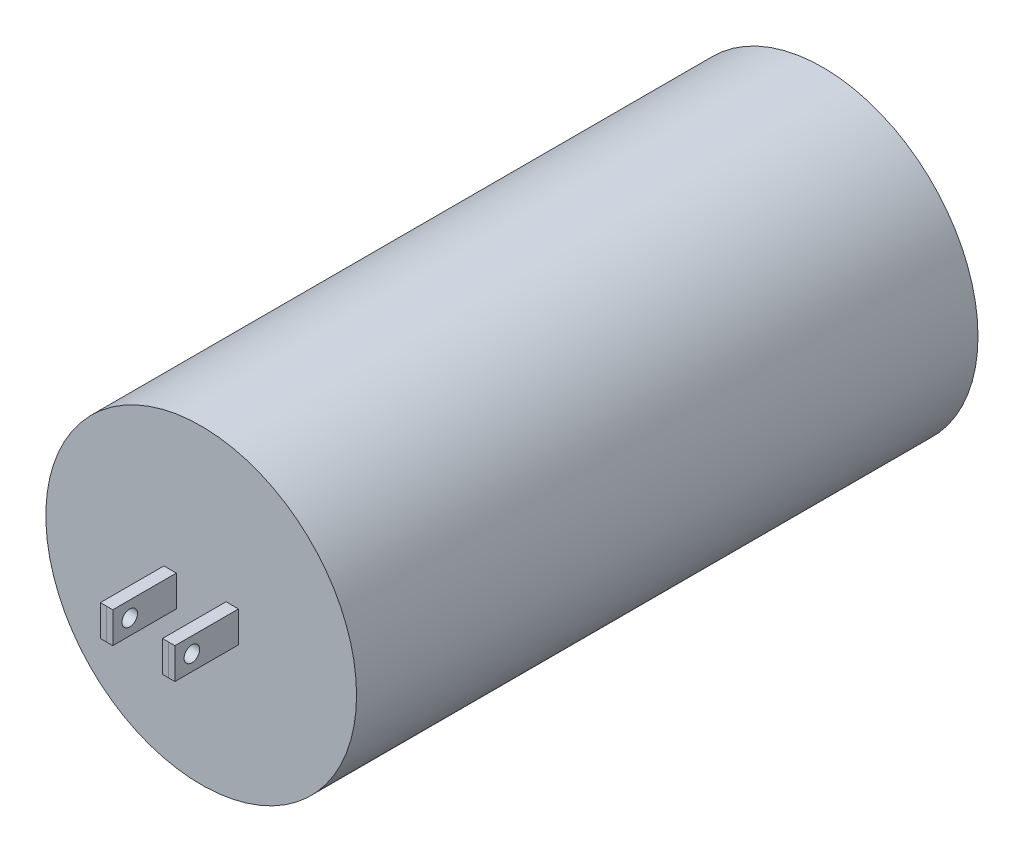
ISO-10303-21;
HEADER;
FILE_DESCRIPTION(('STEP AP214'),'2;1');
FILE_NAME('part.step','',(''),(''),'','','');
FILE_SCHEMA(('AUTOMOTIVE_DESIGN { 1 0 10303 214 1 1 1 1 }'));
ENDSEC;
DATA;
#1=APPLICATION_CONTEXT('core data for automotive mechanical design processes');
#2=APPLICATION_PROTOCOL_DEFINITION('international standard','automotive_design',2000,#1);
#3=PRODUCT_CONTEXT('',#1,'mechanical');
#4=PRODUCT('Part','Part','',(#3));
#5=PRODUCT_RELATED_PRODUCT_CATEGORY('part','',(#4));
#6=PRODUCT_DEFINITION_FORMATION('','',#4);
#7=PRODUCT_DEFINITION_CONTEXT('part definition',#1,'design');
#8=PRODUCT_DEFINITION('design','',#6,#7);
#9=PRODUCT_DEFINITION_SHAPE('','',#8);
#10=(LENGTH_UNIT() NAMED_UNIT(*) SI_UNIT(.MILLI.,.METRE.));
#11=(NAMED_UNIT(*) PLANE_ANGLE_UNIT() SI_UNIT($,.RADIAN.));
#12=(NAMED_UNIT(*) SI_UNIT($,.STERADIAN.) SOLID_ANGLE_UNIT());
#13=UNCERTAINTY_MEASURE_WITH_UNIT(LENGTH_MEASURE(1.E-05),#10,'distance_accuracy_value','');
#14=(GEOMETRIC_REPRESENTATION_CONTEXT(3) GLOBAL_UNCERTAINTY_ASSIGNED_CONTEXT((#13)) GLOBAL_UNIT_ASSIGNED_CONTEXT((#10,
#11,#12)) REPRESENTATION_CONTEXT('',''));
#15=CARTESIAN_POINT('',(0.,0.,0.));
#16=DIRECTION('',(0.,0.,1.));
#17=DIRECTION('',(1.,0.,0.));
#18=AXIS2_PLACEMENT_3D('',#15,#16,#17);
#19=CARTESIAN_POINT('',(0.,0.,200.));
#20=DIRECTION('',(0.,0.,1.));
#21=DIRECTION('',(1.,0.,0.));
#22=AXIS2_PLACEMENT_3D('',#19,#20,#21);
#23=PLANE('',#22);
#24=CARTESIAN_POINT('',(0.,0.,200.));
#25=DIRECTION('',(0.,0.,1.));
#26=DIRECTION('',(1.,0.,0.));
#27=AXIS2_PLACEMENT_3D('',#24,#25,#26);
#28=CIRCLE('',#27,50.);
#29=CARTESIAN_POINT('',(50.,0.,200.));
#30=VERTEX_POINT('',#29);
#31=EDGE_CURVE('E11',#30,#30,#28,.T.);
#32=ORIENTED_EDGE('',*,*,#31,.T.);
#33=EDGE_LOOP('',(#32));
#34=FACE_BOUND('',#33,.T.);
#35=DIRECTION('',(-1.,0.,0.));
#36=VECTOR('',#35,1.);
#37=CARTESIAN_POINT('',(-10.,5.,200.));
#38=LINE('',#37,#36);
#39=CARTESIAN_POINT('',(-8.,5.,200.));
#40=VERTEX_POINT('',#39);
#41=CARTESIAN_POINT('',(-12.,5.,200.));
#42=VERTEX_POINT('',#41);
#43=EDGE_CURVE('E209',#40,#42,#38,.T.);
#44=ORIENTED_EDGE('',*,*,#43,.F.);
#45=DIRECTION('',(0.,-1.,0.));
#46=VECTOR('',#45,1.);
#47=CARTESIAN_POINT('',(-8.,0.,200.));
#48=LINE('',#47,#46);
#49=CARTESIAN_POINT('',(-8.,-5.,200.));
#50=VERTEX_POINT('',#49);
#51=EDGE_CURVE('E164',#40,#50,#48,.T.);
#52=ORIENTED_EDGE('',*,*,#51,.T.);
#53=DIRECTION('',(-1.,0.,0.));
#54=VECTOR('',#53,1.);
#55=CARTESIAN_POINT('',(-10.,-5.,200.));
#56=LINE('',#55,#54);
#57=CARTESIAN_POINT('',(-12.,-5.,200.));
#58=VERTEX_POINT('',#57);
#59=EDGE_CURVE('E219',#50,#58,#56,.T.);
#60=ORIENTED_EDGE('',*,*,#59,.T.);
#61=DIRECTION('',(0.,-1.,0.));
#62=VECTOR('',#61,1.);
#63=CARTESIAN_POINT('',(-12.,5.,200.));
#64=LINE('',#63,#62);
#65=EDGE_CURVE('E229',#42,#58,#64,.T.);
#66=ORIENTED_EDGE('',*,*,#65,.F.);
#67=EDGE_LOOP('',(#44,#52,#60,#66));
#68=FACE_BOUND('',#67,.T.);
#69=DIRECTION('',(-1.,0.,0.));
#70=VECTOR('',#69,1.);
#71=CARTESIAN_POINT('',(10.,-5.,200.));
#72=LINE('',#71,#70);
#73=CARTESIAN_POINT('',(12.,-5.,200.));
#74=VERTEX_POINT('',#73);
#75=CARTESIAN_POINT('',(8.,-5.,200.));
#76=VERTEX_POINT('',#75);
#77=EDGE_CURVE('E57',#74,#76,#72,.T.);
#78=ORIENTED_EDGE('',*,*,#77,.T.);
#79=DIRECTION('',(0.,-1.,0.));
#80=VECTOR('',#79,1.);
#81=CARTESIAN_POINT('',(8.,0.,200.));
#82=LINE('',#81,#80);
#83=CARTESIAN_POINT('',(8.,5.,200.));
#84=VERTEX_POINT('',#83);
#85=EDGE_CURVE('E151',#84,#76,#82,.T.);
#86=ORIENTED_EDGE('',*,*,#85,.F.);
#87=DIRECTION('',(-1.,0.,0.));
#88=VECTOR('',#87,1.);
#89=CARTESIAN_POINT('',(10.,5.,200.));
#90=LINE('',#89,#88);
#91=CARTESIAN_POINT('',(12.,5.,200.));
#92=VERTEX_POINT('',#91);
#93=EDGE_CURVE('E50',#92,#84,#90,.T.);
#94=ORIENTED_EDGE('',*,*,#93,.F.);
#95=DIRECTION('',(0.,-1.,0.));
#96=VECTOR('',#95,1.);
#97=CARTESIAN_POINT('',(12.,5.,200.));
#98=LINE('',#97,#96);
#99=EDGE_CURVE('E193',#92,#74,#98,.T.);
#100=ORIENTED_EDGE('',*,*,#99,.T.);
#101=EDGE_LOOP('',(#78,#86,#94,#100));
#102=FACE_BOUND('',#101,.T.);
#103=ADVANCED_FACE('F33',(#34,#68,#102),#23,.T.);
#104=CARTESIAN_POINT('',(10.,5.,200.));
#105=DIRECTION('',(1.,0.,0.));
#106=DIRECTION('',(0.,0.,-1.));
#107=AXIS2_PLACEMENT_3D('',#104,#105,#106);
#108=PLANE('',#107);
#109=DIRECTION('',(0.,-1.,0.));
#110=VECTOR('',#109,1.);
#111=CARTESIAN_POINT('',(10.,0.,220.46));
#112=LINE('',#111,#110);
#113=CARTESIAN_POINT('',(10.,5.,220.46));
#114=VERTEX_POINT('',#113);
#115=CARTESIAN_POINT('',(10.,-5.,220.46));
#116=VERTEX_POINT('',#115);
#117=EDGE_CURVE('E139',#114,#116,#112,.T.);
#118=ORIENTED_EDGE('',*,*,#117,.T.);
#119=DIRECTION('',(0.,0.,1.));
#120=VECTOR('',#119,1.);
#121=CARTESIAN_POINT('',(10.,-5.,200.));
#122=LINE('',#121,#120);
#123=CARTESIAN_POINT('',(10.,-5.,220.46316815942));
#124=VERTEX_POINT('',#123);
#125=EDGE_CURVE('E125',#116,#124,#122,.T.);
#126=ORIENTED_EDGE('',*,*,#125,.T.);
#127=DIRECTION('',(0.,-1.,0.));
#128=VECTOR('',#127,1.);
#129=CARTESIAN_POINT('',(10.,5.,220.46316815942));
#130=LINE('',#129,#128);
#131=CARTESIAN_POINT('',(10.,5.,220.46316815942));
#132=VERTEX_POINT('',#131);
#133=EDGE_CURVE('E203',#132,#124,#130,.T.);
#134=ORIENTED_EDGE('',*,*,#133,.F.);
#135=DIRECTION('',(0.,0.,1.));
#136=VECTOR('',#135,1.);
#137=CARTESIAN_POINT('',(10.,5.,200.));
#138=LINE('',#137,#136);
#139=EDGE_CURVE('E141',#114,#132,#138,.T.);
#140=ORIENTED_EDGE('',*,*,#139,.F.);
#141=EDGE_LOOP('',(#118,#126,#134,#140));
#142=FACE_BOUND('',#141,.T.);
#143=ADVANCED_FACE('F140',(#142),#108,.F.);
#144=CARTESIAN_POINT('',(0.,0.,200.));
#145=DIRECTION('',(0.,0.,-1.));
#146=DIRECTION('',(-1.,0.,0.));
#147=AXIS2_PLACEMENT_3D('',#144,#145,#146);
#148=CYLINDRICAL_SURFACE('',#147,50.);
#149=ORIENTED_EDGE('',*,*,#31,.F.);
#150=EDGE_LOOP('',(#149));
#151=FACE_BOUND('',#150,.T.);
#152=CARTESIAN_POINT('',(0.,0.,0.));
#153=DIRECTION('',(0.,0.,1.));
#154=DIRECTION('',(1.,0.,0.));
#155=AXIS2_PLACEMENT_3D('',#152,#153,#154);
#156=CIRCLE('',#155,50.);
#157=CARTESIAN_POINT('',(50.,0.,0.));
#158=VERTEX_POINT('',#157);
#159=EDGE_CURVE('E42',#158,#158,#156,.T.);
#160=ORIENTED_EDGE('',*,*,#159,.T.);
#161=EDGE_LOOP('',(#160));
#162=FACE_BOUND('',#161,.T.);
#163=ADVANCED_FACE('F35',(#151,#162),#148,.T.);
#164=CARTESIAN_POINT('',(0.,0.,0.));
#165=DIRECTION('',(0.,0.,1.));
#166=DIRECTION('',(1.,0.,0.));
#167=AXIS2_PLACEMENT_3D('',#164,#165,#166);
#168=PLANE('',#167);
#169=ORIENTED_EDGE('',*,*,#159,.F.);
#170=EDGE_LOOP('',(#169));
#171=FACE_BOUND('',#170,.T.);
#172=ADVANCED_FACE('F281',(#171),#168,.F.);
#173=CARTESIAN_POINT('',(-10.,5.,200.));
#174=DIRECTION('',(-1.,0.,0.));
#175=DIRECTION('',(0.,0.,1.));
#176=AXIS2_PLACEMENT_3D('',#173,#174,#175);
#177=PLANE('',#176);
#178=DIRECTION('',(0.,0.,-1.));
#179=VECTOR('',#178,1.);
#180=CARTESIAN_POINT('',(-10.,-5.,200.));
#181=LINE('',#180,#179);
#182=CARTESIAN_POINT('',(-10.,-5.,220.46316815942));
#183=VERTEX_POINT('',#182);
#184=CARTESIAN_POINT('',(-10.,-5.,220.46));
#185=VERTEX_POINT('',#184);
#186=EDGE_CURVE('E205',#183,#185,#181,.T.);
#187=ORIENTED_EDGE('',*,*,#186,.T.);
#188=DIRECTION('',(0.,-1.,0.));
#189=VECTOR('',#188,1.);
#190=CARTESIAN_POINT('',(-10.,0.,220.46));
#191=LINE('',#190,#189);
#192=CARTESIAN_POINT('',(-10.,5.,220.46));
#193=VERTEX_POINT('',#192);
#194=EDGE_CURVE('E168',#193,#185,#191,.T.);
#195=ORIENTED_EDGE('',*,*,#194,.F.);
#196=DIRECTION('',(0.,0.,-1.));
#197=VECTOR('',#196,1.);
#198=CARTESIAN_POINT('',(-10.,5.,200.));
#199=LINE('',#198,#197);
#200=CARTESIAN_POINT('',(-10.,5.,220.46316815942));
#201=VERTEX_POINT('',#200);
#202=EDGE_CURVE('E206',#201,#193,#199,.T.);
#203=ORIENTED_EDGE('',*,*,#202,.F.);
#204=DIRECTION('',(0.,-1.,0.));
#205=VECTOR('',#204,1.);
#206=CARTESIAN_POINT('',(-10.,5.,220.46316815942));
#207=LINE('',#206,#205);
#208=EDGE_CURVE('E217',#201,#183,#207,.T.);
#209=ORIENTED_EDGE('',*,*,#208,.T.);
#210=EDGE_LOOP('',(#187,#195,#203,#209));
#211=FACE_BOUND('',#210,.T.);
#212=ADVANCED_FACE('F279',(#211),#177,.F.);
#213=CARTESIAN_POINT('',(-12.,5.,200.));
#214=DIRECTION('',(1.,0.,0.));
#215=DIRECTION('',(0.,0.,-1.));
#216=AXIS2_PLACEMENT_3D('',#213,#214,#215);
#217=PLANE('',#216);
#218=CARTESIAN_POINT('',(-12.,0.,215.));
#219=DIRECTION('',(1.,0.,0.));
#220=DIRECTION('',(0.,0.,-1.));
#221=AXIS2_PLACEMENT_3D('',#218,#219,#220);
#222=CIRCLE('',#221,2.5);
#223=CARTESIAN_POINT('',(-12.,0.,212.5));
#224=VERTEX_POINT('',#223);
#225=EDGE_CURVE('E136',#224,#224,#222,.T.);
#226=ORIENTED_EDGE('',*,*,#225,.T.);
#227=EDGE_LOOP('',(#226));
#228=FACE_BOUND('',#227,.T.);
#229=DIRECTION('',(0.,0.,1.));
#230=VECTOR('',#229,1.);
#231=CARTESIAN_POINT('',(-12.,-5.,200.));
#232=LINE('',#231,#230);
#233=CARTESIAN_POINT('',(-12.,-5.,220.46316815942));
#234=VERTEX_POINT('',#233);
#235=EDGE_CURVE('E221',#58,#234,#232,.T.);
#236=ORIENTED_EDGE('',*,*,#235,.T.);
#237=DIRECTION('',(0.,-1.,0.));
#238=VECTOR('',#237,1.);
#239=CARTESIAN_POINT('',(-12.,5.,220.46316815942));
#240=LINE('',#239,#238);
#241=CARTESIAN_POINT('',(-12.,5.,220.46316815942));
#242=VERTEX_POINT('',#241);
#243=EDGE_CURVE('E226',#242,#234,#240,.T.);
#244=ORIENTED_EDGE('',*,*,#243,.F.);
#245=DIRECTION('',(0.,0.,1.));
#246=VECTOR('',#245,1.);
#247=CARTESIAN_POINT('',(-12.,5.,200.));
#248=LINE('',#247,#246);
#249=EDGE_CURVE('E213',#42,#242,#248,.T.);
#250=ORIENTED_EDGE('',*,*,#249,.F.);
#251=ORIENTED_EDGE('',*,*,#65,.T.);
#252=EDGE_LOOP('',(#236,#244,#250,#251));
#253=FACE_BOUND('',#252,.T.);
#254=ADVANCED_FACE('F273',(#228,#253),#217,.F.);
#255=CARTESIAN_POINT('',(-10.,5.,220.46316815942));
#256=DIRECTION('',(0.,0.,-1.));
#257=DIRECTION('',(-1.,0.,0.));
#258=AXIS2_PLACEMENT_3D('',#255,#256,#257);
#259=PLANE('',#258);
#260=DIRECTION('',(1.,0.,0.));
#261=VECTOR('',#260,1.);
#262=CARTESIAN_POINT('',(-10.,-5.,220.46316815942));
#263=LINE('',#262,#261);
#264=EDGE_CURVE('E210',#234,#183,#263,.T.);
#265=ORIENTED_EDGE('',*,*,#264,.T.);
#266=ORIENTED_EDGE('',*,*,#208,.F.);
#267=DIRECTION('',(1.,0.,0.));
#268=VECTOR('',#267,1.);
#269=CARTESIAN_POINT('',(-10.,5.,220.46316815942));
#270=LINE('',#269,#268);
#271=EDGE_CURVE('E215',#242,#201,#270,.T.);
#272=ORIENTED_EDGE('',*,*,#271,.F.);
#273=ORIENTED_EDGE('',*,*,#243,.T.);
#274=EDGE_LOOP('',(#265,#266,#272,#273));
#275=FACE_BOUND('',#274,.T.);
#276=ADVANCED_FACE('F276',(#275),#259,.F.);
#277=CARTESIAN_POINT('',(0.,5.,0.));
#278=DIRECTION('',(0.,-1.,0.));
#279=DIRECTION('',(0.,0.,-1.));
#280=AXIS2_PLACEMENT_3D('',#277,#278,#279);
#281=PLANE('',#280);
#282=ORIENTED_EDGE('',*,*,#202,.T.);
#283=DIRECTION('',(-1.,0.,0.));
#284=VECTOR('',#283,1.);
#285=CARTESIAN_POINT('',(0.,5.,220.46));
#286=LINE('',#285,#284);
#287=CARTESIAN_POINT('',(-8.,5.,220.46));
#288=VERTEX_POINT('',#287);
#289=EDGE_CURVE('E165',#288,#193,#286,.T.);
#290=ORIENTED_EDGE('',*,*,#289,.F.);
#291=DIRECTION('',(0.,0.,-1.));
#292=VECTOR('',#291,1.);
#293=CARTESIAN_POINT('',(-8.,5.,220.46));
#294=LINE('',#293,#292);
#295=EDGE_CURVE('E177',#288,#40,#294,.T.);
#296=ORIENTED_EDGE('',*,*,#295,.T.);
#297=ORIENTED_EDGE('',*,*,#43,.T.);
#298=ORIENTED_EDGE('',*,*,#249,.T.);
#299=ORIENTED_EDGE('',*,*,#271,.T.);
#300=EDGE_LOOP('',(#282,#290,#296,#297,#298,#299));
#301=FACE_BOUND('',#300,.T.);
#302=ADVANCED_FACE('F261',(#301),#281,.F.);
#303=CARTESIAN_POINT('',(0.,-5.,0.));
#304=DIRECTION('',(0.,-1.,0.));
#305=DIRECTION('',(0.,0.,-1.));
#306=AXIS2_PLACEMENT_3D('',#303,#304,#305);
#307=PLANE('',#306);
#308=ORIENTED_EDGE('',*,*,#186,.F.);
#309=ORIENTED_EDGE('',*,*,#264,.F.);
#310=ORIENTED_EDGE('',*,*,#235,.F.);
#311=ORIENTED_EDGE('',*,*,#59,.F.);
#312=DIRECTION('',(0.,0.,-1.));
#313=VECTOR('',#312,1.);
#314=CARTESIAN_POINT('',(-8.,-5.,220.46));
#315=LINE('',#314,#313);
#316=CARTESIAN_POINT('',(-8.,-5.,220.46));
#317=VERTEX_POINT('',#316);
#318=EDGE_CURVE('E182',#317,#50,#315,.T.);
#319=ORIENTED_EDGE('',*,*,#318,.F.);
#320=DIRECTION('',(-1.,0.,0.));
#321=VECTOR('',#320,1.);
#322=CARTESIAN_POINT('',(0.,-5.,220.46));
#323=LINE('',#322,#321);
#324=EDGE_CURVE('E171',#317,#185,#323,.T.);
#325=ORIENTED_EDGE('',*,*,#324,.T.);
#326=EDGE_LOOP('',(#308,#309,#310,#311,#319,#325));
#327=FACE_BOUND('',#326,.T.);
#328=ADVANCED_FACE('F268',(#327),#307,.T.);
#329=CARTESIAN_POINT('',(10.,5.,220.46316815942));
#330=DIRECTION('',(0.,0.,-1.));
#331=DIRECTION('',(-1.,0.,0.));
#332=AXIS2_PLACEMENT_3D('',#329,#330,#331);
#333=PLANE('',#332);
#334=DIRECTION('',(1.,0.,0.));
#335=VECTOR('',#334,1.);
#336=CARTESIAN_POINT('',(10.,-5.,220.46316815942));
#337=LINE('',#336,#335);
#338=CARTESIAN_POINT('',(12.,-5.,220.46316815942));
#339=VERTEX_POINT('',#338);
#340=EDGE_CURVE('E132',#124,#339,#337,.T.);
#341=ORIENTED_EDGE('',*,*,#340,.T.);
#342=DIRECTION('',(0.,-1.,0.));
#343=VECTOR('',#342,1.);
#344=CARTESIAN_POINT('',(12.,5.,220.46316815942));
#345=LINE('',#344,#343);
#346=CARTESIAN_POINT('',(12.,5.,220.46316815942));
#347=VERTEX_POINT('',#346);
#348=EDGE_CURVE('E200',#347,#339,#345,.T.);
#349=ORIENTED_EDGE('',*,*,#348,.F.);
#350=DIRECTION('',(1.,0.,0.));
#351=VECTOR('',#350,1.);
#352=CARTESIAN_POINT('',(10.,5.,220.46316815942));
#353=LINE('',#352,#351);
#354=EDGE_CURVE('E189',#132,#347,#353,.T.);
#355=ORIENTED_EDGE('',*,*,#354,.F.);
#356=ORIENTED_EDGE('',*,*,#133,.T.);
#357=EDGE_LOOP('',(#341,#349,#355,#356));
#358=FACE_BOUND('',#357,.T.);
#359=ADVANCED_FACE('F327',(#358),#333,.F.);
#360=CARTESIAN_POINT('',(12.,5.,200.));
#361=DIRECTION('',(-1.,0.,0.));
#362=DIRECTION('',(0.,0.,1.));
#363=AXIS2_PLACEMENT_3D('',#360,#361,#362);
#364=PLANE('',#363);
#365=CARTESIAN_POINT('',(12.,0.,215.));
#366=DIRECTION('',(-1.,0.,0.));
#367=DIRECTION('',(0.,0.,1.));
#368=AXIS2_PLACEMENT_3D('',#365,#366,#367);
#369=CIRCLE('',#368,2.5);
#370=CARTESIAN_POINT('',(12.,0.,217.5));
#371=VERTEX_POINT('',#370);
#372=EDGE_CURVE('E185',#371,#371,#369,.T.);
#373=ORIENTED_EDGE('',*,*,#372,.T.);
#374=EDGE_LOOP('',(#373));
#375=FACE_BOUND('',#374,.T.);
#376=DIRECTION('',(0.,0.,-1.));
#377=VECTOR('',#376,1.);
#378=CARTESIAN_POINT('',(12.,-5.,200.));
#379=LINE('',#378,#377);
#380=EDGE_CURVE('E196',#339,#74,#379,.T.);
#381=ORIENTED_EDGE('',*,*,#380,.T.);
#382=ORIENTED_EDGE('',*,*,#99,.F.);
#383=DIRECTION('',(0.,0.,-1.));
#384=VECTOR('',#383,1.);
#385=CARTESIAN_POINT('',(12.,5.,200.));
#386=LINE('',#385,#384);
#387=EDGE_CURVE('E191',#347,#92,#386,.T.);
#388=ORIENTED_EDGE('',*,*,#387,.F.);
#389=ORIENTED_EDGE('',*,*,#348,.T.);
#390=EDGE_LOOP('',(#381,#382,#388,#389));
#391=FACE_BOUND('',#390,.T.);
#392=ADVANCED_FACE('F236',(#375,#391),#364,.F.);
#393=CARTESIAN_POINT('',(0.,5.,0.));
#394=DIRECTION('',(0.,1.,0.));
#395=DIRECTION('',(0.,0.,1.));
#396=AXIS2_PLACEMENT_3D('',#393,#394,#395);
#397=PLANE('',#396);
#398=ORIENTED_EDGE('',*,*,#93,.T.);
#399=DIRECTION('',(0.,0.,-1.));
#400=VECTOR('',#399,1.);
#401=CARTESIAN_POINT('',(8.,5.,220.46));
#402=LINE('',#401,#400);
#403=CARTESIAN_POINT('',(8.,5.,220.46));
#404=VERTEX_POINT('',#403);
#405=EDGE_CURVE('E161',#404,#84,#402,.T.);
#406=ORIENTED_EDGE('',*,*,#405,.F.);
#407=DIRECTION('',(1.,0.,0.));
#408=VECTOR('',#407,1.);
#409=CARTESIAN_POINT('',(0.,5.,220.46));
#410=LINE('',#409,#408);
#411=EDGE_CURVE('E145',#404,#114,#410,.T.);
#412=ORIENTED_EDGE('',*,*,#411,.T.);
#413=ORIENTED_EDGE('',*,*,#139,.T.);
#414=ORIENTED_EDGE('',*,*,#354,.T.);
#415=ORIENTED_EDGE('',*,*,#387,.T.);
#416=EDGE_LOOP('',(#398,#406,#412,#413,#414,#415));
#417=FACE_BOUND('',#416,.T.);
#418=ADVANCED_FACE('F347',(#417),#397,.T.);
#419=CARTESIAN_POINT('',(0.,-5.,0.));
#420=DIRECTION('',(0.,1.,0.));
#421=DIRECTION('',(0.,0.,1.));
#422=AXIS2_PLACEMENT_3D('',#419,#420,#421);
#423=PLANE('',#422);
#424=ORIENTED_EDGE('',*,*,#125,.F.);
#425=DIRECTION('',(1.,0.,0.));
#426=VECTOR('',#425,1.);
#427=CARTESIAN_POINT('',(0.,-5.,220.46));
#428=LINE('',#427,#426);
#429=CARTESIAN_POINT('',(8.,-5.,220.46));
#430=VERTEX_POINT('',#429);
#431=EDGE_CURVE('E130',#430,#116,#428,.T.);
#432=ORIENTED_EDGE('',*,*,#431,.F.);
#433=DIRECTION('',(0.,0.,-1.));
#434=VECTOR('',#433,1.);
#435=CARTESIAN_POINT('',(8.,-5.,220.46));
#436=LINE('',#435,#434);
#437=EDGE_CURVE('E158',#430,#76,#436,.T.);
#438=ORIENTED_EDGE('',*,*,#437,.T.);
#439=ORIENTED_EDGE('',*,*,#77,.F.);
#440=ORIENTED_EDGE('',*,*,#380,.F.);
#441=ORIENTED_EDGE('',*,*,#340,.F.);
#442=EDGE_LOOP('',(#424,#432,#438,#439,#440,#441));
#443=FACE_BOUND('',#442,.T.);
#444=ADVANCED_FACE('F127',(#443),#423,.F.);
#445=CARTESIAN_POINT('',(-17.,0.,215.));
#446=DIRECTION('',(1.,0.,0.));
#447=DIRECTION('',(0.,0.,-1.));
#448=AXIS2_PLACEMENT_3D('',#445,#446,#447);
#449=CYLINDRICAL_SURFACE('',#448,2.5);
#450=ORIENTED_EDGE('',*,*,#372,.F.);
#451=EDGE_LOOP('',(#450));
#452=FACE_BOUND('',#451,.T.);
#453=CARTESIAN_POINT('',(8.,0.,215.));
#454=DIRECTION('',(1.,0.,0.));
#455=DIRECTION('',(0.,0.,-1.));
#456=AXIS2_PLACEMENT_3D('',#453,#454,#455);
#457=CIRCLE('',#456,2.5);
#458=CARTESIAN_POINT('',(8.,0.,212.5));
#459=VERTEX_POINT('',#458);
#460=EDGE_CURVE('E37',#459,#459,#457,.T.);
#461=ORIENTED_EDGE('',*,*,#460,.F.);
#462=EDGE_LOOP('',(#461));
#463=FACE_BOUND('',#462,.T.);
#464=ADVANCED_FACE('F239',(#452,#463),#449,.F.);
#465=ORIENTED_EDGE('',*,*,#225,.F.);
#466=EDGE_LOOP('',(#465));
#467=FACE_BOUND('',#466,.T.);
#468=CARTESIAN_POINT('',(-8.,0.,215.));
#469=DIRECTION('',(1.,0.,0.));
#470=DIRECTION('',(0.,0.,-1.));
#471=AXIS2_PLACEMENT_3D('',#468,#469,#470);
#472=CIRCLE('',#471,2.5);
#473=CARTESIAN_POINT('',(-8.,0.,212.5));
#474=VERTEX_POINT('',#473);
#475=EDGE_CURVE('E153',#474,#474,#472,.T.);
#476=ORIENTED_EDGE('',*,*,#475,.T.);
#477=EDGE_LOOP('',(#476));
#478=FACE_BOUND('',#477,.T.);
#479=ADVANCED_FACE('F242',(#467,#478),#449,.F.);
#480=CARTESIAN_POINT('',(-8.,0.,220.46));
#481=DIRECTION('',(1.,0.,0.));
#482=DIRECTION('',(0.,0.,-1.));
#483=AXIS2_PLACEMENT_3D('',#480,#481,#482);
#484=PLANE('',#483);
#485=ORIENTED_EDGE('',*,*,#475,.F.);
#486=EDGE_LOOP('',(#485));
#487=FACE_BOUND('',#486,.T.);
#488=ORIENTED_EDGE('',*,*,#51,.F.);
#489=ORIENTED_EDGE('',*,*,#295,.F.);
#490=DIRECTION('',(0.,-1.,0.));
#491=VECTOR('',#490,1.);
#492=CARTESIAN_POINT('',(-8.,0.,220.46));
#493=LINE('',#492,#491);
#494=EDGE_CURVE('E174',#288,#317,#493,.T.);
#495=ORIENTED_EDGE('',*,*,#494,.T.);
#496=ORIENTED_EDGE('',*,*,#318,.T.);
#497=EDGE_LOOP('',(#488,#489,#495,#496));
#498=FACE_BOUND('',#497,.T.);
#499=ADVANCED_FACE('F251',(#487,#498),#484,.T.);
#500=CARTESIAN_POINT('',(0.,0.,220.46));
#501=DIRECTION('',(0.,0.,1.));
#502=DIRECTION('',(1.,0.,0.));
#503=AXIS2_PLACEMENT_3D('',#500,#501,#502);
#504=PLANE('',#503);
#505=ORIENTED_EDGE('',*,*,#289,.T.);
#506=ORIENTED_EDGE('',*,*,#194,.T.);
#507=ORIENTED_EDGE('',*,*,#324,.F.);
#508=ORIENTED_EDGE('',*,*,#494,.F.);
#509=EDGE_LOOP('',(#505,#506,#507,#508));
#510=FACE_BOUND('',#509,.T.);
#511=ADVANCED_FACE('F254',(#510),#504,.T.);
#512=CARTESIAN_POINT('',(8.,0.,220.46));
#513=DIRECTION('',(1.,0.,0.));
#514=DIRECTION('',(0.,0.,-1.));
#515=AXIS2_PLACEMENT_3D('',#512,#513,#514);
#516=PLANE('',#515);
#517=ORIENTED_EDGE('',*,*,#460,.T.);
#518=EDGE_LOOP('',(#517));
#519=FACE_BOUND('',#518,.T.);
#520=ORIENTED_EDGE('',*,*,#85,.T.);
#521=ORIENTED_EDGE('',*,*,#437,.F.);
#522=DIRECTION('',(0.,-1.,0.));
#523=VECTOR('',#522,1.);
#524=CARTESIAN_POINT('',(8.,0.,220.46));
#525=LINE('',#524,#523);
#526=EDGE_CURVE('E149',#404,#430,#525,.T.);
#527=ORIENTED_EDGE('',*,*,#526,.F.);
#528=ORIENTED_EDGE('',*,*,#405,.T.);
#529=EDGE_LOOP('',(#520,#521,#527,#528));
#530=FACE_BOUND('',#529,.T.);
#531=ADVANCED_FACE('F402',(#519,#530),#516,.F.);
#532=CARTESIAN_POINT('',(0.,0.,220.46));
#533=DIRECTION('',(0.,0.,-1.));
#534=DIRECTION('',(-1.,0.,0.));
#535=AXIS2_PLACEMENT_3D('',#532,#533,#534);
#536=PLANE('',#535);
#537=ORIENTED_EDGE('',*,*,#431,.T.);
#538=ORIENTED_EDGE('',*,*,#117,.F.);
#539=ORIENTED_EDGE('',*,*,#411,.F.);
#540=ORIENTED_EDGE('',*,*,#526,.T.);
#541=EDGE_LOOP('',(#537,#538,#539,#540));
#542=FACE_BOUND('',#541,.T.);
#543=ADVANCED_FACE('F147',(#542),#536,.F.);
#544=CLOSED_SHELL('',(#103,#143,#163,#172,#212,#254,#276,#302,#328,#359,#392,#418,#444,#464,
#479,#499,#511,#531,#543));
#545=MANIFOLD_SOLID_BREP('B2',#544);
#546=ADVANCED_BREP_SHAPE_REPRESENTATION('',(#18,#545),#14);
#547=SHAPE_DEFINITION_REPRESENTATION(#9,#546);
ENDSEC;
END-ISO-10303-21;
